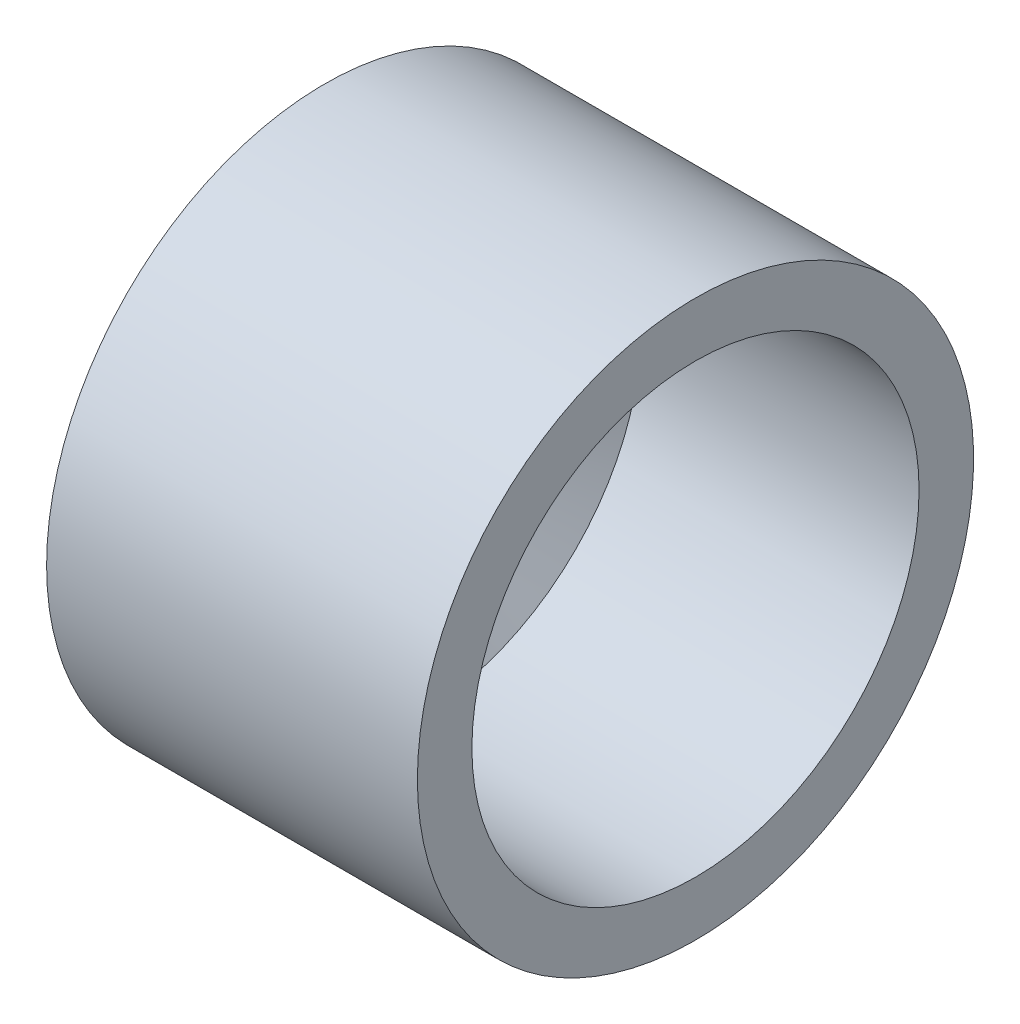
ISO-10303-21;
HEADER;
FILE_DESCRIPTION(('STEP AP214'),'2;1');
FILE_NAME('part.step','',(''),(''),'','','');
FILE_SCHEMA(('AUTOMOTIVE_DESIGN { 1 0 10303 214 1 1 1 1 }'));
ENDSEC;
DATA;
#1=APPLICATION_CONTEXT('core data for automotive mechanical design processes');
#2=APPLICATION_PROTOCOL_DEFINITION('international standard','automotive_design',2000,#1);
#3=PRODUCT_CONTEXT('',#1,'mechanical');
#4=PRODUCT('Part','Part','',(#3));
#5=PRODUCT_RELATED_PRODUCT_CATEGORY('part','',(#4));
#6=PRODUCT_DEFINITION_FORMATION('','',#4);
#7=PRODUCT_DEFINITION_CONTEXT('part definition',#1,'design');
#8=PRODUCT_DEFINITION('design','',#6,#7);
#9=PRODUCT_DEFINITION_SHAPE('','',#8);
#10=(LENGTH_UNIT() NAMED_UNIT(*) SI_UNIT(.MILLI.,.METRE.));
#11=(NAMED_UNIT(*) PLANE_ANGLE_UNIT() SI_UNIT($,.RADIAN.));
#12=(NAMED_UNIT(*) SI_UNIT($,.STERADIAN.) SOLID_ANGLE_UNIT());
#13=UNCERTAINTY_MEASURE_WITH_UNIT(LENGTH_MEASURE(1.E-05),#10,'distance_accuracy_value','');
#14=(GEOMETRIC_REPRESENTATION_CONTEXT(3) GLOBAL_UNCERTAINTY_ASSIGNED_CONTEXT((#13)) GLOBAL_UNIT_ASSIGNED_CONTEXT((#10,
#11,#12)) REPRESENTATION_CONTEXT('',''));
#15=CARTESIAN_POINT('',(0.,0.,0.));
#16=DIRECTION('',(0.,0.,1.));
#17=DIRECTION('',(1.,0.,0.));
#18=AXIS2_PLACEMENT_3D('',#15,#16,#17);
#19=CARTESIAN_POINT('',(12.7,9.525,0.));
#20=DIRECTION('',(-1.,0.,0.));
#21=DIRECTION('',(0.,0.,1.));
#22=AXIS2_PLACEMENT_3D('',#19,#20,#21);
#23=PLANE('',#22);
#24=CARTESIAN_POINT('',(12.7,0.,0.));
#25=DIRECTION('',(-1.,0.,0.));
#26=DIRECTION('',(0.,0.,1.));
#27=AXIS2_PLACEMENT_3D('',#24,#25,#26);
#28=CIRCLE('',#27,9.525);
#29=CARTESIAN_POINT('',(12.7,0.,9.525));
#30=VERTEX_POINT('',#29);
#31=EDGE_CURVE('E127',#30,#30,#28,.T.);
#32=ORIENTED_EDGE('',*,*,#31,.F.);
#33=EDGE_LOOP('',(#32));
#34=FACE_BOUND('',#33,.T.);
#35=CARTESIAN_POINT('',(12.7,0.,0.));
#36=DIRECTION('',(1.,0.,0.));
#37=DIRECTION('',(0.,0.,-1.));
#38=AXIS2_PLACEMENT_3D('',#35,#36,#37);
#39=CIRCLE('',#38,7.6581);
#40=CARTESIAN_POINT('',(12.7,0.,-7.6581));
#41=VERTEX_POINT('',#40);
#42=EDGE_CURVE('E147',#41,#41,#39,.T.);
#43=ORIENTED_EDGE('',*,*,#42,.F.);
#44=EDGE_LOOP('',(#43));
#45=FACE_BOUND('',#44,.T.);
#46=ADVANCED_FACE('F42',(#34,#45),#23,.F.);
#47=CARTESIAN_POINT('',(0.889,0.,0.));
#48=DIRECTION('',(1.,0.,0.));
#49=DIRECTION('',(0.,0.,-1.));
#50=AXIS2_PLACEMENT_3D('',#47,#48,#49);
#51=PLANE('',#50);
#52=CARTESIAN_POINT('',(0.889,0.,0.));
#53=DIRECTION('',(-1.,0.,0.));
#54=DIRECTION('',(0.,0.,1.));
#55=AXIS2_PLACEMENT_3D('',#52,#53,#54);
#56=CIRCLE('',#55,8.255);
#57=CARTESIAN_POINT('',(0.889,0.,8.255));
#58=VERTEX_POINT('',#57);
#59=EDGE_CURVE('E122',#58,#58,#56,.T.);
#60=ORIENTED_EDGE('',*,*,#59,.T.);
#61=EDGE_LOOP('',(#60));
#62=FACE_BOUND('',#61,.T.);
#63=CARTESIAN_POINT('',(0.889,-2.54,0.));
#64=DIRECTION('',(-1.,0.,0.));
#65=DIRECTION('',(0.,0.,1.));
#66=AXIS2_PLACEMENT_3D('',#63,#64,#65);
#67=CIRCLE('',#66,4.7625);
#68=CARTESIAN_POINT('',(0.889,-2.54,-4.7625));
#69=VERTEX_POINT('',#68);
#70=CARTESIAN_POINT('',(0.889,-2.54,4.7625));
#71=VERTEX_POINT('',#70);
#72=EDGE_CURVE('E106',#69,#71,#67,.T.);
#73=ORIENTED_EDGE('',*,*,#72,.F.);
#74=DIRECTION('',(0.,-1.,0.));
#75=VECTOR('',#74,1.);
#76=CARTESIAN_POINT('',(0.889,-2.54,-4.7625));
#77=LINE('',#76,#75);
#78=CARTESIAN_POINT('',(0.889,2.54,-4.7625));
#79=VERTEX_POINT('',#78);
#80=EDGE_CURVE('E109',#79,#69,#77,.T.);
#81=ORIENTED_EDGE('',*,*,#80,.F.);
#82=CARTESIAN_POINT('',(0.889,2.54,0.));
#83=DIRECTION('',(-1.,0.,0.));
#84=DIRECTION('',(0.,0.,1.));
#85=AXIS2_PLACEMENT_3D('',#82,#83,#84);
#86=CIRCLE('',#85,4.7625);
#87=CARTESIAN_POINT('',(0.889,2.54,4.7625));
#88=VERTEX_POINT('',#87);
#89=EDGE_CURVE('E114',#88,#79,#86,.T.);
#90=ORIENTED_EDGE('',*,*,#89,.F.);
#91=DIRECTION('',(0.,1.,0.));
#92=VECTOR('',#91,1.);
#93=CARTESIAN_POINT('',(0.889,-2.54,4.7625));
#94=LINE('',#93,#92);
#95=EDGE_CURVE('E208',#71,#88,#94,.T.);
#96=ORIENTED_EDGE('',*,*,#95,.F.);
#97=EDGE_LOOP('',(#73,#81,#90,#96));
#98=FACE_BOUND('',#97,.T.);
#99=ADVANCED_FACE('F143',(#62,#98),#51,.F.);
#100=CARTESIAN_POINT('',(0.,8.255,0.));
#101=DIRECTION('',(1.,0.,0.));
#102=DIRECTION('',(0.,0.,-1.));
#103=AXIS2_PLACEMENT_3D('',#100,#101,#102);
#104=PLANE('',#103);
#105=CARTESIAN_POINT('',(0.,0.,0.));
#106=DIRECTION('',(-1.,0.,0.));
#107=DIRECTION('',(0.,0.,1.));
#108=AXIS2_PLACEMENT_3D('',#105,#106,#107);
#109=CIRCLE('',#108,8.255);
#110=CARTESIAN_POINT('',(0.,0.,8.255));
#111=VERTEX_POINT('',#110);
#112=EDGE_CURVE('E118',#111,#111,#109,.T.);
#113=ORIENTED_EDGE('',*,*,#112,.F.);
#114=EDGE_LOOP('',(#113));
#115=FACE_BOUND('',#114,.T.);
#116=CARTESIAN_POINT('',(0.,0.,0.));
#117=DIRECTION('',(-1.,0.,0.));
#118=DIRECTION('',(0.,0.,1.));
#119=AXIS2_PLACEMENT_3D('',#116,#117,#118);
#120=CIRCLE('',#119,9.525);
#121=CARTESIAN_POINT('',(0.,0.,9.525));
#122=VERTEX_POINT('',#121);
#123=EDGE_CURVE('E57',#122,#122,#120,.T.);
#124=ORIENTED_EDGE('',*,*,#123,.T.);
#125=EDGE_LOOP('',(#124));
#126=FACE_BOUND('',#125,.T.);
#127=ADVANCED_FACE('F44',(#115,#126),#104,.F.);
#128=CARTESIAN_POINT('',(0.,0.,0.));
#129=DIRECTION('',(-1.,0.,0.));
#130=DIRECTION('',(0.,0.,1.));
#131=AXIS2_PLACEMENT_3D('',#128,#129,#130);
#132=CYLINDRICAL_SURFACE('',#131,9.525);
#133=ORIENTED_EDGE('',*,*,#123,.F.);
#134=EDGE_LOOP('',(#133));
#135=FACE_BOUND('',#134,.T.);
#136=ORIENTED_EDGE('',*,*,#31,.T.);
#137=EDGE_LOOP('',(#136));
#138=FACE_BOUND('',#137,.T.);
#139=ADVANCED_FACE('F135',(#135,#138),#132,.T.);
#140=CARTESIAN_POINT('',(0.,0.,0.));
#141=DIRECTION('',(-1.,0.,0.));
#142=DIRECTION('',(0.,0.,1.));
#143=AXIS2_PLACEMENT_3D('',#140,#141,#142);
#144=CYLINDRICAL_SURFACE('',#143,8.255);
#145=ORIENTED_EDGE('',*,*,#59,.F.);
#146=EDGE_LOOP('',(#145));
#147=FACE_BOUND('',#146,.T.);
#148=ORIENTED_EDGE('',*,*,#112,.T.);
#149=EDGE_LOOP('',(#148));
#150=FACE_BOUND('',#149,.T.);
#151=ADVANCED_FACE('F138',(#147,#150),#144,.F.);
#152=CARTESIAN_POINT('',(12.7,-2.54,0.));
#153=DIRECTION('',(-1.,0.,0.));
#154=DIRECTION('',(0.,0.,1.));
#155=AXIS2_PLACEMENT_3D('',#152,#153,#154);
#156=CYLINDRICAL_SURFACE('',#155,4.7625);
#157=DIRECTION('',(-1.,0.,0.));
#158=VECTOR('',#157,1.);
#159=CARTESIAN_POINT('',(12.7,-2.54,4.7625));
#160=LINE('',#159,#158);
#161=CARTESIAN_POINT('',(1.8166944846263,-2.54,4.7625));
#162=VERTEX_POINT('',#161);
#163=EDGE_CURVE('E98',#162,#71,#160,.T.);
#164=ORIENTED_EDGE('',*,*,#163,.F.);
#165=CARTESIAN_POINT('',(1.81663793254557,-2.5398,4.76249999580053));
#166=CARTESIAN_POINT('',(1.85004131127603,-2.65793033309281,4.76250557513708));
#167=CARTESIAN_POINT('',(1.88295589494162,-2.77616135091777,4.75811306479156));
#168=CARTESIAN_POINT('',(1.94773997399968,-3.01224615403858,4.74050703532966));
#169=CARTESIAN_POINT('',(1.97960951417332,-3.13009995530273,4.72729389470561));
#170=CARTESIAN_POINT('',(2.07359845486314,-3.48241120195924,4.67436044515336));
#171=CARTESIAN_POINT('',(2.13405011029088,-3.715447537512,4.62134601975443));
#172=CARTESIAN_POINT('',(2.25883238065766,-4.20780595314145,4.46946944032145));
#173=CARTESIAN_POINT('',(2.32229444444025,-4.46554963579238,4.36474028013833));
#174=CARTESIAN_POINT('',(2.44140634098642,-4.96020573955409,4.11110983860393));
#175=CARTESIAN_POINT('',(2.49705874922548,-5.1971250184801,3.96222317022648));
#176=CARTESIAN_POINT('',(2.59843614910634,-5.63654533480481,3.62862366260589));
#177=CARTESIAN_POINT('',(2.6443832806386,-5.83978626373392,3.44495318731052));
#178=CARTESIAN_POINT('',(2.7275166222184,-6.21259519332304,3.04438590208046));
#179=CARTESIAN_POINT('',(2.76470279895632,-6.38216306595585,2.8274889658221));
#180=CARTESIAN_POINT('',(2.82893959625904,-6.67802755293865,2.37272564929722));
#181=CARTESIAN_POINT('',(2.85622754123311,-6.80533012991794,2.13554692665146));
#182=CARTESIAN_POINT('',(2.90160972206256,-7.01839440037417,1.64240309332203));
#183=CARTESIAN_POINT('',(2.91970558963029,-7.10416346645888,1.38644132610996));
#184=CARTESIAN_POINT('',(2.94620886537148,-7.23016039578479,0.868140099717964));
#185=CARTESIAN_POINT('',(2.9547892812987,-7.27120125035724,0.606006168492479));
#186=CARTESIAN_POINT('',(2.9627333867999,-7.30918691055332,0.0782816375083821));
#187=CARTESIAN_POINT('',(2.96209744680909,-7.30613348846882,-0.187308822892431));
#188=CARTESIAN_POINT('',(2.95427503991186,-7.26875043717521,-0.581045903102251));
#189=CARTESIAN_POINT('',(2.95054920883951,-7.25094831931399,-0.711042871759624));
#190=CARTESIAN_POINT('',(2.94085135254045,-7.20471000365701,-0.969033327375599));
#191=CARTESIAN_POINT('',(2.93488016138184,-7.17627775458363,-1.0970275399172));
#192=CARTESIAN_POINT('',(2.9207085474545,-7.10898805331137,-1.35015582363349));
#193=CARTESIAN_POINT('',(2.9125073640456,-7.07012704396915,-1.47528890307146));
#194=CARTESIAN_POINT('',(2.89390744308682,-6.98230902709373,-1.72174346383576));
#195=CARTESIAN_POINT('',(2.88350949022883,-6.93335562474067,-1.84306628846762));
#196=CARTESIAN_POINT('',(2.86051304257227,-6.82556172686081,-2.08147429267058));
#197=CARTESIAN_POINT('',(2.84790784815856,-6.76669115112202,-2.19854522133407));
#198=CARTESIAN_POINT('',(2.8205653445546,-6.6396523637968,-2.4272118706183));
#199=CARTESIAN_POINT('',(2.80582878900623,-6.57148743914551,-2.53880950797541));
#200=CARTESIAN_POINT('',(2.77426235028035,-6.42634439324161,-2.75586367140134));
#201=CARTESIAN_POINT('',(2.75743170540726,-6.34936306596081,-2.86131794230922));
#202=CARTESIAN_POINT('',(2.72174166172636,-6.18722366426648,-3.06531173536775));
#203=CARTESIAN_POINT('',(2.7028829597715,-6.10206839954182,-3.16385361355132));
#204=CARTESIAN_POINT('',(2.66292324997486,-5.9229959824157,-3.35471285530281));
#205=CARTESIAN_POINT('',(2.64179537635648,-5.82897594607832,-3.44692806636454));
#206=CARTESIAN_POINT('',(2.59758763730376,-5.63392067392156,-3.6230263705483));
#207=CARTESIAN_POINT('',(2.57450843284176,-5.53288781560809,-3.70691226428257));
#208=CARTESIAN_POINT('',(2.526451488527,-5.3244754222887,-3.86591409202173));
#209=CARTESIAN_POINT('',(2.50147269083484,-5.2170923585126,-3.94102507956233));
#210=CARTESIAN_POINT('',(2.44971520839099,-4.99685875601223,-4.08195260675548));
#211=CARTESIAN_POINT('',(2.42293712529756,-4.88401004841941,-4.147772230718));
#212=CARTESIAN_POINT('',(2.36703581961334,-4.65103869369185,-4.27114540959279));
#213=CARTESIAN_POINT('',(2.33787345923654,-4.5308096504162,-4.32848035909706));
#214=CARTESIAN_POINT('',(2.2778499850641,-4.28638225210853,-4.43274225451243));
#215=CARTESIAN_POINT('',(2.24698943341607,-4.16218521623219,-4.47967261906135));
#216=CARTESIAN_POINT('',(2.18367384944509,-3.91074059826677,-4.56289449832302));
#217=CARTESIAN_POINT('',(2.15121953994184,-3.7834944122296,-4.59919078483628));
#218=CARTESIAN_POINT('',(2.08481834709042,-3.52684201476397,-4.66100491632911));
#219=CARTESIAN_POINT('',(2.05087198557842,-3.39743656819369,-4.68652649709478));
#220=CARTESIAN_POINT('',(1.98406809489552,-3.1466431967295,-4.72528442451589));
#221=CARTESIAN_POINT('',(1.95130662282186,-3.02534459262207,-4.73926953184351));
#222=CARTESIAN_POINT('',(1.88474342251687,-2.7825822853818,-4.75787464075774));
#223=CARTESIAN_POINT('',(1.85094395178613,-2.66111942330639,-4.76251368133082));
#224=CARTESIAN_POINT('',(1.81663793254557,-2.5398,-4.76249999580053));
#225=B_SPLINE_CURVE_WITH_KNOTS('',3,(#165,#166,#167,#168,#169,#170,#171,#172,#173,#174,#175,
#176,#177,#178,#179,#180,#181,#182,#183,#184,#185,#186,#187,#188,#189,#190,#191,#192,#193,#194,
#195,#196,#197,#198,#199,#200,#201,#202,#203,#204,#205,#206,#207,#208,#209,#210,#211,#212,#213,
#214,#215,#216,#217,#218,#219,#220,#221,#222,#223,#224),.UNSPECIFIED.,.F.,.F.,(4,2,2,2,2,2,2,2,
2,2,2,2,2,2,2,2,2,2,2,2,2,2,2,2,2,2,2,2,2,4),(0.,0.368132579579565,0.73624936364296,
1.47301055012698,2.32483019269558,3.17636825788451,4.0055664297543,4.83476775423051,
5.6425171682163,6.45012314610764,7.24279158638289,8.03542816683334,8.4288369870485,
8.82209981459184,9.21549695092616,9.60875380162911,10.0032256726441,10.3975583992539,
10.792034980485,11.1863764476107,11.586048726369,11.9855861627888,12.3853477449492,
12.7849763108148,13.1935715126944,13.6020322626928,14.010309443512,14.418444950734,
14.7973590988579,15.1755005726741),.UNSPECIFIED.);
#226=CARTESIAN_POINT('',(1.8166944846263,-2.54,-4.7625));
#227=VERTEX_POINT('',#226);
#228=EDGE_CURVE('E11',#162,#227,#225,.T.);
#229=ORIENTED_EDGE('',*,*,#228,.T.);
#230=DIRECTION('',(-1.,0.,0.));
#231=VECTOR('',#230,1.);
#232=CARTESIAN_POINT('',(12.7,-2.54,-4.7625));
#233=LINE('',#232,#231);
#234=EDGE_CURVE('E123',#227,#69,#233,.T.);
#235=ORIENTED_EDGE('',*,*,#234,.T.);
#236=ORIENTED_EDGE('',*,*,#72,.T.);
#237=EDGE_LOOP('',(#164,#229,#235,#236));
#238=FACE_BOUND('',#237,.T.);
#239=ADVANCED_FACE('F104',(#238),#156,.F.);
#240=CARTESIAN_POINT('',(12.7,-2.54,-4.7625));
#241=DIRECTION('',(0.,0.,-1.));
#242=DIRECTION('',(0.,1.,0.));
#243=AXIS2_PLACEMENT_3D('',#240,#241,#242);
#244=PLANE('',#243);
#245=ORIENTED_EDGE('',*,*,#234,.F.);
#246=CARTESIAN_POINT('',(3.5555834414712,-6.78730578230942,-4.7625));
#247=CARTESIAN_POINT('',(3.45902323345425,-6.59092856899193,-4.7625));
#248=CARTESIAN_POINT('',(3.36352738393763,-6.39401766289216,-4.7625));
#249=CARTESIAN_POINT('',(3.17525326896915,-5.99885415172681,-4.7625));
#250=CARTESIAN_POINT('',(3.08247555193056,-5.80060128570452,-4.7625));
#251=CARTESIAN_POINT('',(2.89970493621723,-5.40133292870124,-4.7625));
#252=CARTESIAN_POINT('',(2.8097326958655,-5.20030794413643,-4.7625));
#253=CARTESIAN_POINT('',(2.63403369899284,-4.79641757556608,-4.7625));
#254=CARTESIAN_POINT('',(2.5483066996672,-4.59355229760237,-4.7625));
#255=CARTESIAN_POINT('',(2.38159662086839,-4.18417096752135,-4.7625));
#256=CARTESIAN_POINT('',(2.30065200034912,-3.97763916373458,-4.7625));
#257=CARTESIAN_POINT('',(2.14563680051861,-3.56196742149427,-4.7625));
#258=CARTESIAN_POINT('',(2.07156694938339,-3.35282720941327,-4.7625));
#259=CARTESIAN_POINT('',(1.9323479404999,-2.93210152493024,-4.7625));
#260=CARTESIAN_POINT('',(1.86717865096314,-2.72052278537074,-4.7625));
#261=CARTESIAN_POINT('',(1.74787538205475,-2.2943076202374,-4.7625));
#262=CARTESIAN_POINT('',(1.69373796974497,-2.07967216817402,-4.7625));
#263=CARTESIAN_POINT('',(1.59634822162053,-1.63482469028507,-4.7625));
#264=CARTESIAN_POINT('',(1.55390852876962,-1.40443081754685,-4.7625));
#265=CARTESIAN_POINT('',(1.48733681537381,-0.940950322199805,-4.7625));
#266=CARTESIAN_POINT('',(1.46320438062448,-0.707863760634603,-4.7625));
#267=CARTESIAN_POINT('',(1.43545960582825,-0.241675637291908,-4.7625));
#268=CARTESIAN_POINT('',(1.43173957583104,-0.00858065482752009,-4.7625));
#269=CARTESIAN_POINT('',(1.44489466994021,0.456981008038887,-4.7625));
#270=CARTESIAN_POINT('',(1.46176618372194,0.689447791422106,-4.7625));
#271=CARTESIAN_POINT('',(1.50694434994955,1.0857047782289,-4.7625));
#272=CARTESIAN_POINT('',(1.53057836071555,1.2500538308629,-4.7625));
#273=CARTESIAN_POINT('',(1.58653018782063,1.57727757700361,-4.7625));
#274=CARTESIAN_POINT('',(1.6188493536533,1.74015203732038,-4.7625));
#275=CARTESIAN_POINT('',(1.72731198637712,2.22686923926102,-4.7625));
#276=CARTESIAN_POINT('',(1.81488185263466,2.54818378062378,-4.7625));
#277=CARTESIAN_POINT('',(1.96358964739493,3.02815990562683,-4.7625));
#278=CARTESIAN_POINT('',(2.01668409250669,3.18945170059227,-4.7625));
#279=CARTESIAN_POINT('',(2.12763876258068,3.51041723779947,-4.7625));
#280=CARTESIAN_POINT('',(2.18549938920614,3.67009084239449,-4.7625));
#281=CARTESIAN_POINT('',(2.30482747701334,3.98704422390878,-4.7625));
#282=CARTESIAN_POINT('',(2.36627279303754,4.14433241757381,-4.7625));
#283=CARTESIAN_POINT('',(2.49241835743125,4.45754104082691,-4.7625));
#284=CARTESIAN_POINT('',(2.55711754013959,4.61346189883092,-4.7625));
#285=CARTESIAN_POINT('',(2.62314168775837,4.76880734621152,-4.7625));
#286=B_SPLINE_CURVE_WITH_KNOTS('',3,(#246,#247,#248,#249,#250,#251,#252,#253,#254,#255,#256,
#257,#258,#259,#260,#261,#262,#263,#264,#265,#266,#267,#268,#269,#270,#271,#272,#273,#274,#275,
#276,#277,#278,#279,#280,#281,#282,#283,#284,#285),.UNSPECIFIED.,.F.,.F.,(4,2,2,2,2,2,2,2,2,2,2,
2,2,2,2,2,2,2,2,4),(0.,0.656509648215523,1.31315085484133,1.97383418515344,2.63447968422072,
3.29986620487351,3.9653231230711,4.62924902319749,5.29296800397195,5.99515137125295,
6.69731885105755,7.39577831056831,8.09411532645742,8.59199433317717,9.08995074477859,
10.0877363142178,10.5971179731199,11.1065426034473,11.6130986136666,12.1194897905557),.UNSPECIFIED.);
#287=CARTESIAN_POINT('',(1.8166944846263,2.54,-4.7625));
#288=VERTEX_POINT('',#287);
#289=EDGE_CURVE('E64',#227,#288,#286,.T.);
#290=ORIENTED_EDGE('',*,*,#289,.T.);
#291=DIRECTION('',(-1.,0.,0.));
#292=VECTOR('',#291,1.);
#293=CARTESIAN_POINT('',(12.7,2.54,-4.7625));
#294=LINE('',#293,#292);
#295=EDGE_CURVE('E70',#288,#79,#294,.T.);
#296=ORIENTED_EDGE('',*,*,#295,.T.);
#297=ORIENTED_EDGE('',*,*,#80,.T.);
#298=EDGE_LOOP('',(#245,#290,#296,#297));
#299=FACE_BOUND('',#298,.T.);
#300=ADVANCED_FACE('F168',(#299),#244,.F.);
#301=CARTESIAN_POINT('',(12.7,2.54,0.));
#302=DIRECTION('',(-1.,0.,0.));
#303=DIRECTION('',(0.,0.,1.));
#304=AXIS2_PLACEMENT_3D('',#301,#302,#303);
#305=CYLINDRICAL_SURFACE('',#304,4.7625);
#306=ORIENTED_EDGE('',*,*,#295,.F.);
#307=CARTESIAN_POINT('',(1.81663793254557,2.5398,-4.76249999580053));
#308=CARTESIAN_POINT('',(1.85004131127603,2.6579303330928,-4.76250557513708));
#309=CARTESIAN_POINT('',(1.88295589494162,2.77616135091777,-4.75811306479156));
#310=CARTESIAN_POINT('',(1.94773997399969,3.01224615403858,-4.74050703532966));
#311=CARTESIAN_POINT('',(1.97960951417332,3.13009995530273,-4.72729389470561));
#312=CARTESIAN_POINT('',(2.07359845486314,3.48241120195924,-4.67436044515336));
#313=CARTESIAN_POINT('',(2.13405011029088,3.715447537512,-4.62134601975443));
#314=CARTESIAN_POINT('',(2.25883238065766,4.20780595314145,-4.46946944032145));
#315=CARTESIAN_POINT('',(2.32229444444025,4.46554963579238,-4.36474028013833));
#316=CARTESIAN_POINT('',(2.44140634098642,4.96020573955409,-4.11110983860394));
#317=CARTESIAN_POINT('',(2.49705874922548,5.1971250184801,-3.96222317022648));
#318=CARTESIAN_POINT('',(2.59843614910634,5.63654533480481,-3.6286236626059));
#319=CARTESIAN_POINT('',(2.6443832806386,5.83978626373392,-3.44495318731053));
#320=CARTESIAN_POINT('',(2.7275166222184,6.21259519332304,-3.04438590208046));
#321=CARTESIAN_POINT('',(2.76470279895632,6.38216306595584,-2.8274889658221));
#322=CARTESIAN_POINT('',(2.82893959625904,6.67802755293865,-2.37272564929723));
#323=CARTESIAN_POINT('',(2.85622754123311,6.80533012991794,-2.13554692665147));
#324=CARTESIAN_POINT('',(2.90160972206256,7.01839440037417,-1.64240309332203));
#325=CARTESIAN_POINT('',(2.91970558963029,7.10416346645888,-1.38644132610996));
#326=CARTESIAN_POINT('',(2.94620886537148,7.23016039578479,-0.868140099717965));
#327=CARTESIAN_POINT('',(2.9547892812987,7.27120125035724,-0.60600616849248));
#328=CARTESIAN_POINT('',(2.9627333867999,7.30918691055332,-0.0782816375083832));
#329=CARTESIAN_POINT('',(2.96209744680909,7.30613348846882,0.18730882289243));
#330=CARTESIAN_POINT('',(2.95427503991186,7.2687504371752,0.581045903102249));
#331=CARTESIAN_POINT('',(2.95054920883951,7.25094831931399,0.711042871759622));
#332=CARTESIAN_POINT('',(2.94085135254045,7.20471000365701,0.969033327375596));
#333=CARTESIAN_POINT('',(2.93488016138184,7.17627775458363,1.0970275399172));
#334=CARTESIAN_POINT('',(2.9207085474545,7.10898805331137,1.35015582363348));
#335=CARTESIAN_POINT('',(2.9125073640456,7.07012704396915,1.47528890307146));
#336=CARTESIAN_POINT('',(2.89390744308682,6.98230902709374,1.72174346383576));
#337=CARTESIAN_POINT('',(2.88350949022883,6.93335562474067,1.84306628846762));
#338=CARTESIAN_POINT('',(2.86051304257227,6.82556172686081,2.08147429267058));
#339=CARTESIAN_POINT('',(2.84790784815856,6.76669115112202,2.19854522133407));
#340=CARTESIAN_POINT('',(2.8205653445546,6.6396523637968,2.4272118706183));
#341=CARTESIAN_POINT('',(2.80582878900623,6.57148743914551,2.53880950797541));
#342=CARTESIAN_POINT('',(2.77426235028035,6.42634439324161,2.75586367140134));
#343=CARTESIAN_POINT('',(2.75743170540726,6.34936306596081,2.86131794230922));
#344=CARTESIAN_POINT('',(2.72174166172636,6.18722366426648,3.06531173536775));
#345=CARTESIAN_POINT('',(2.7028829597715,6.10206839954182,3.16385361355132));
#346=CARTESIAN_POINT('',(2.66292324997486,5.9229959824157,3.35471285530281));
#347=CARTESIAN_POINT('',(2.64179537635648,5.82897594607832,3.44692806636454));
#348=CARTESIAN_POINT('',(2.59758763730376,5.63392067392156,3.62302637054829));
#349=CARTESIAN_POINT('',(2.57450843284176,5.53288781560809,3.70691226428257));
#350=CARTESIAN_POINT('',(2.526451488527,5.3244754222887,3.86591409202173));
#351=CARTESIAN_POINT('',(2.50147269083484,5.21709235851259,3.94102507956233));
#352=CARTESIAN_POINT('',(2.44971520839099,4.99685875601223,4.08195260675548));
#353=CARTESIAN_POINT('',(2.42293712529756,4.88401004841941,4.147772230718));
#354=CARTESIAN_POINT('',(2.36703581961334,4.65103869369185,4.27114540959279));
#355=CARTESIAN_POINT('',(2.33787345923654,4.5308096504162,4.32848035909706));
#356=CARTESIAN_POINT('',(2.2778499850641,4.28638225210854,4.43274225451243));
#357=CARTESIAN_POINT('',(2.24698943341607,4.16218521623219,4.47967261906135));
#358=CARTESIAN_POINT('',(2.18367384944509,3.91074059826678,4.56289449832302));
#359=CARTESIAN_POINT('',(2.15121953994184,3.78349441222961,4.59919078483628));
#360=CARTESIAN_POINT('',(2.08481834709042,3.52684201476397,4.66100491632911));
#361=CARTESIAN_POINT('',(2.05087198557842,3.39743656819369,4.68652649709478));
#362=CARTESIAN_POINT('',(1.98406809489552,3.1466431967295,4.72528442451589));
#363=CARTESIAN_POINT('',(1.95130662282186,3.02534459262206,4.73926953184351));
#364=CARTESIAN_POINT('',(1.88474342251687,2.78258228538179,4.75787464075773));
#365=CARTESIAN_POINT('',(1.85094395178613,2.66111942330639,4.76251368133082));
#366=CARTESIAN_POINT('',(1.81663793254557,2.5398,4.76249999580053));
#367=B_SPLINE_CURVE_WITH_KNOTS('',3,(#307,#308,#309,#310,#311,#312,#313,#314,#315,#316,#317,
#318,#319,#320,#321,#322,#323,#324,#325,#326,#327,#328,#329,#330,#331,#332,#333,#334,#335,#336,
#337,#338,#339,#340,#341,#342,#343,#344,#345,#346,#347,#348,#349,#350,#351,#352,#353,#354,#355,
#356,#357,#358,#359,#360,#361,#362,#363,#364,#365,#366),.UNSPECIFIED.,.F.,.F.,(4,2,2,2,2,2,2,2,
2,2,2,2,2,2,2,2,2,2,2,2,2,2,2,2,2,2,2,2,2,4),(0.,0.368132579579565,0.736249363642959,
1.47301055012698,2.32483019269558,3.17636825788451,4.0055664297543,4.83476775423051,
5.6425171682163,6.45012314610764,7.24279158638289,8.03542816683334,8.4288369870485,
8.82209981459184,9.21549695092616,9.60875380162911,10.0032256726441,10.3975583992539,
10.792034980485,11.1863764476107,11.586048726369,11.9855861627888,12.3853477449492,
12.7849763108148,13.1935715126944,13.6020322626928,14.010309443512,14.418444950734,
14.7973590988579,15.1755005726741),.UNSPECIFIED.);
#368=CARTESIAN_POINT('',(1.8166944846263,2.54,4.7625));
#369=VERTEX_POINT('',#368);
#370=EDGE_CURVE('E102',#288,#369,#367,.T.);
#371=ORIENTED_EDGE('',*,*,#370,.T.);
#372=DIRECTION('',(-1.,0.,0.));
#373=VECTOR('',#372,1.);
#374=CARTESIAN_POINT('',(12.7,2.54,4.7625));
#375=LINE('',#374,#373);
#376=EDGE_CURVE('E100',#369,#88,#375,.T.);
#377=ORIENTED_EDGE('',*,*,#376,.T.);
#378=ORIENTED_EDGE('',*,*,#89,.T.);
#379=EDGE_LOOP('',(#306,#371,#377,#378));
#380=FACE_BOUND('',#379,.T.);
#381=ADVANCED_FACE('F186',(#380),#305,.F.);
#382=CARTESIAN_POINT('',(12.7,-2.54,4.7625));
#383=DIRECTION('',(0.,0.,1.));
#384=DIRECTION('',(0.,-1.,0.));
#385=AXIS2_PLACEMENT_3D('',#382,#383,#384);
#386=PLANE('',#385);
#387=ORIENTED_EDGE('',*,*,#376,.F.);
#388=CARTESIAN_POINT('',(3.55558344148104,-6.78730578232943,4.7625));
#389=CARTESIAN_POINT('',(3.45902323346366,-6.59092856901125,4.7625));
#390=CARTESIAN_POINT('',(3.36352738394661,-6.3940176629108,4.7625));
#391=CARTESIAN_POINT('',(3.17525326897727,-5.99885415174408,4.7625));
#392=CARTESIAN_POINT('',(3.08247555193825,-5.8006012857211,4.7625));
#393=CARTESIAN_POINT('',(2.89970493622407,-5.40133292871642,4.7625));
#394=CARTESIAN_POINT('',(2.80973269587191,-5.20030794415092,4.7625));
#395=CARTESIAN_POINT('',(2.63403369899842,-4.79641757557916,4.7625));
#396=CARTESIAN_POINT('',(2.54830669967235,-4.59355229761474,4.7625));
#397=CARTESIAN_POINT('',(2.38159662087272,-4.18417096753229,4.7625));
#398=CARTESIAN_POINT('',(2.30065200035305,-3.9776391637448,4.7625));
#399=CARTESIAN_POINT('',(2.14563680052176,-3.56196742150304,4.7625));
#400=CARTESIAN_POINT('',(2.07156694938616,-3.3528272094213,4.7625));
#401=CARTESIAN_POINT('',(1.93234794050195,-2.93210152493679,4.7625));
#402=CARTESIAN_POINT('',(1.86717865096486,-2.72052278537654,4.7625));
#403=CARTESIAN_POINT('',(1.74787538205586,-2.29430762024168,4.7625));
#404=CARTESIAN_POINT('',(1.6937379697458,-2.07967216817753,4.7625));
#405=CARTESIAN_POINT('',(1.59634822162082,-1.63482469028671,4.7625));
#406=CARTESIAN_POINT('',(1.55390852876968,-1.40443081754738,4.7625));
#407=CARTESIAN_POINT('',(1.48733681537358,-0.940950322198089,4.7625));
#408=CARTESIAN_POINT('',(1.4632043806242,-0.707863760631753,4.7625));
#409=CARTESIAN_POINT('',(1.43545960582806,-0.241675637286798,4.7625));
#410=CARTESIAN_POINT('',(1.431739575831,-0.00858065482128406,4.7625));
#411=CARTESIAN_POINT('',(1.44489466994067,0.456981008047351,4.7625));
#412=CARTESIAN_POINT('',(1.46176618372273,0.689447791431673,4.7625));
#413=CARTESIAN_POINT('',(1.50694434995101,1.0857047782399,4.7625));
#414=CARTESIAN_POINT('',(1.53057836071727,1.25005383087424,4.7625));
#415=CARTESIAN_POINT('',(1.58653018782289,1.57727757701563,4.7625));
#416=CARTESIAN_POINT('',(1.61884935365585,1.74015203733273,4.7625));
#417=CARTESIAN_POINT('',(1.72731198638051,2.22686923927435,4.7625));
#418=CARTESIAN_POINT('',(1.81488185263862,2.54818378063774,4.7625));
#419=CARTESIAN_POINT('',(1.96358964739973,3.02815990564174,4.7625));
#420=CARTESIAN_POINT('',(2.01668409251177,3.18945170060749,4.7625));
#421=CARTESIAN_POINT('',(2.12763876258633,3.51041723781532,4.7625));
#422=CARTESIAN_POINT('',(2.18549938921207,3.67009084241066,4.7625));
#423=CARTESIAN_POINT('',(2.30482747701982,3.98704422392558,4.7625));
#424=CARTESIAN_POINT('',(2.36627279304429,4.14433241759092,4.7625));
#425=CARTESIAN_POINT('',(2.49241835743852,4.45754104084463,4.7625));
#426=CARTESIAN_POINT('',(2.55711754014713,4.61346189884896,4.7625));
#427=CARTESIAN_POINT('',(2.62314168776617,4.76880734622986,4.7625));
#428=B_SPLINE_CURVE_WITH_KNOTS('',3,(#388,#389,#390,#391,#392,#393,#394,#395,#396,#397,#398,
#399,#400,#401,#402,#403,#404,#405,#406,#407,#408,#409,#410,#411,#412,#413,#414,#415,#416,#417,
#418,#419,#420,#421,#422,#423,#424,#425,#426,#427),.UNSPECIFIED.,.F.,.F.,(4,2,2,2,2,2,2,2,2,2,2,
2,2,2,2,2,2,2,2,4),(0.,0.656509648217935,1.31315085484616,1.97383418516071,2.63447968423044,
3.29986620488567,3.96532312308572,4.62924902321455,5.29296800399146,5.99515137127584,
6.69731885108384,7.39577831059795,8.09411532649042,8.59199433321131,9.08995074481387,
10.0877363142553,10.5971179731586,11.1065426034872,11.6130986137076,12.1194897905979),.UNSPECIFIED.);
#429=EDGE_CURVE('E89',#369,#162,#428,.F.);
#430=ORIENTED_EDGE('',*,*,#429,.T.);
#431=ORIENTED_EDGE('',*,*,#163,.T.);
#432=ORIENTED_EDGE('',*,*,#95,.T.);
#433=EDGE_LOOP('',(#387,#430,#431,#432));
#434=FACE_BOUND('',#433,.T.);
#435=ADVANCED_FACE('F96',(#434),#386,.F.);
#436=CARTESIAN_POINT('',(3.175,0.,0.));
#437=DIRECTION('',(1.,0.,0.));
#438=DIRECTION('',(0.,0.,-1.));
#439=AXIS2_PLACEMENT_3D('',#436,#437,#438);
#440=CONICAL_SURFACE('',#439,7.65809999999999,1.02974425867665);
#441=CARTESIAN_POINT('',(3.175,0.,0.));
#442=DIRECTION('',(1.,0.,0.));
#443=DIRECTION('',(0.,0.,-1.));
#444=AXIS2_PLACEMENT_3D('',#441,#442,#443);
#445=CIRCLE('',#444,7.65809999999999);
#446=CARTESIAN_POINT('',(3.175,0.,-7.65809999999999));
#447=VERTEX_POINT('',#446);
#448=EDGE_CURVE('E150',#447,#447,#445,.T.);
#449=ORIENTED_EDGE('',*,*,#448,.T.);
#450=EDGE_LOOP('',(#449));
#451=FACE_BOUND('',#450,.T.);
#452=ORIENTED_EDGE('',*,*,#289,.F.);
#453=ORIENTED_EDGE('',*,*,#228,.F.);
#454=ORIENTED_EDGE('',*,*,#429,.F.);
#455=ORIENTED_EDGE('',*,*,#370,.F.);
#456=EDGE_LOOP('',(#452,#453,#454,#455));
#457=FACE_BOUND('',#456,.T.);
#458=ADVANCED_FACE('F88',(#451,#457),#440,.F.);
#459=CARTESIAN_POINT('',(12.7,0.,0.));
#460=DIRECTION('',(1.,0.,0.));
#461=DIRECTION('',(0.,0.,-1.));
#462=AXIS2_PLACEMENT_3D('',#459,#460,#461);
#463=CYLINDRICAL_SURFACE('',#462,7.65809999999999);
#464=ORIENTED_EDGE('',*,*,#448,.F.);
#465=EDGE_LOOP('',(#464));
#466=FACE_BOUND('',#465,.T.);
#467=ORIENTED_EDGE('',*,*,#42,.T.);
#468=EDGE_LOOP('',(#467));
#469=FACE_BOUND('',#468,.T.);
#470=ADVANCED_FACE('F174',(#466,#469),#463,.F.);
#471=CLOSED_SHELL('',(#46,#99,#127,#139,#151,#239,#300,#381,#435,#458,#470));
#472=MANIFOLD_SOLID_BREP('B2',#471);
#473=ADVANCED_BREP_SHAPE_REPRESENTATION('',(#18,#472),#14);
#474=SHAPE_DEFINITION_REPRESENTATION(#9,#473);
ENDSEC;
END-ISO-10303-21;
